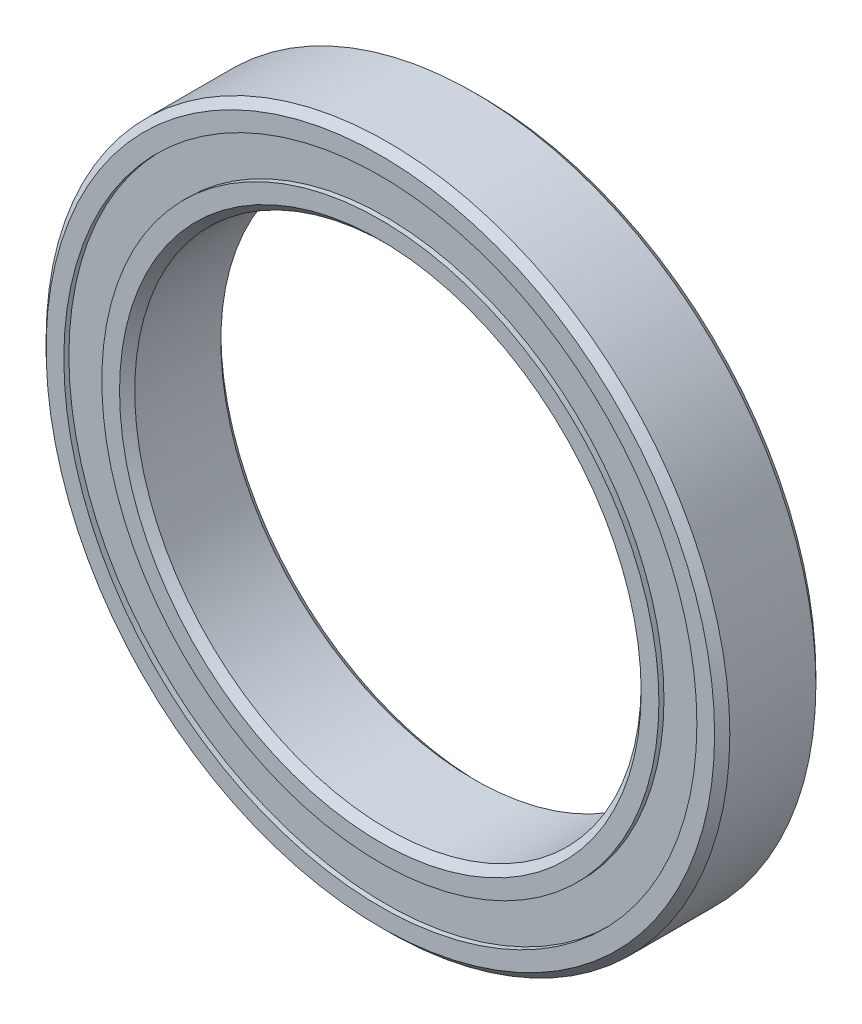
ISO-10303-21;
HEADER;
FILE_DESCRIPTION(('STEP AP214'),'2;1');
FILE_NAME('part.step','',(''),(''),'','','');
FILE_SCHEMA(('AUTOMOTIVE_DESIGN { 1 0 10303 214 1 1 1 1 }'));
ENDSEC;
DATA;
#1=APPLICATION_CONTEXT('core data for automotive mechanical design processes');
#2=APPLICATION_PROTOCOL_DEFINITION('international standard','automotive_design',2000,#1);
#3=PRODUCT_CONTEXT('',#1,'mechanical');
#4=PRODUCT('Part','Part','',(#3));
#5=PRODUCT_RELATED_PRODUCT_CATEGORY('part','',(#4));
#6=PRODUCT_DEFINITION_FORMATION('','',#4);
#7=PRODUCT_DEFINITION_CONTEXT('part definition',#1,'design');
#8=PRODUCT_DEFINITION('design','',#6,#7);
#9=PRODUCT_DEFINITION_SHAPE('','',#8);
#10=(LENGTH_UNIT() NAMED_UNIT(*) SI_UNIT(.MILLI.,.METRE.));
#11=(NAMED_UNIT(*) PLANE_ANGLE_UNIT() SI_UNIT($,.RADIAN.));
#12=(NAMED_UNIT(*) SI_UNIT($,.STERADIAN.) SOLID_ANGLE_UNIT());
#13=UNCERTAINTY_MEASURE_WITH_UNIT(LENGTH_MEASURE(1.E-05),#10,'distance_accuracy_value','');
#14=(GEOMETRIC_REPRESENTATION_CONTEXT(3) GLOBAL_UNCERTAINTY_ASSIGNED_CONTEXT((#13)) GLOBAL_UNIT_ASSIGNED_CONTEXT((#10,
#11,#12)) REPRESENTATION_CONTEXT('',''));
#15=CARTESIAN_POINT('',(0.,0.,0.));
#16=DIRECTION('',(0.,0.,1.));
#17=DIRECTION('',(1.,0.,0.));
#18=AXIS2_PLACEMENT_3D('',#15,#16,#17);
#19=CARTESIAN_POINT('',(0.,0.,1.7));
#20=DIRECTION('',(0.,0.,1.));
#21=DIRECTION('',(1.,0.,0.));
#22=AXIS2_PLACEMENT_3D('',#19,#20,#21);
#23=CONICAL_SURFACE('',#22,10.,0.7853981625);
#24=CARTESIAN_POINT('',(0.,0.,1.7));
#25=DIRECTION('',(0.,0.,1.));
#26=DIRECTION('',(1.,0.,0.));
#27=AXIS2_PLACEMENT_3D('',#24,#25,#26);
#28=CIRCLE('',#27,10.);
#29=CARTESIAN_POINT('',(10.,0.,1.7));
#30=VERTEX_POINT('',#29);
#31=EDGE_CURVE('E110',#30,#30,#28,.T.);
#32=ORIENTED_EDGE('',*,*,#31,.F.);
#33=EDGE_LOOP('',(#32));
#34=FACE_BOUND('',#33,.T.);
#35=CARTESIAN_POINT('',(0.,0.,2.));
#36=DIRECTION('',(0.,0.,-1.));
#37=DIRECTION('',(1.,0.,0.));
#38=AXIS2_PLACEMENT_3D('',#35,#36,#37);
#39=CIRCLE('',#38,10.3);
#40=CARTESIAN_POINT('',(10.3,0.,2.));
#41=VERTEX_POINT('',#40);
#42=EDGE_CURVE('E125',#41,#41,#39,.T.);
#43=ORIENTED_EDGE('',*,*,#42,.F.);
#44=EDGE_LOOP('',(#43));
#45=FACE_BOUND('',#44,.T.);
#46=ADVANCED_FACE('F17',(#34,#45),#23,.F.);
#47=CARTESIAN_POINT('',(0.,0.,-2.));
#48=DIRECTION('',(0.,0.,-1.));
#49=DIRECTION('',(-1.,0.,0.));
#50=AXIS2_PLACEMENT_3D('',#47,#48,#49);
#51=CONICAL_SURFACE('',#50,10.3,0.7853981625);
#52=CARTESIAN_POINT('',(0.,0.,-2.));
#53=DIRECTION('',(0.,0.,1.));
#54=DIRECTION('',(1.,0.,0.));
#55=AXIS2_PLACEMENT_3D('',#52,#53,#54);
#56=CIRCLE('',#55,10.3);
#57=CARTESIAN_POINT('',(10.3,0.,-2.));
#58=VERTEX_POINT('',#57);
#59=EDGE_CURVE('E138',#58,#58,#56,.T.);
#60=ORIENTED_EDGE('',*,*,#59,.F.);
#61=EDGE_LOOP('',(#60));
#62=FACE_BOUND('',#61,.T.);
#63=CARTESIAN_POINT('',(0.,0.,-1.7));
#64=DIRECTION('',(0.,0.,-1.));
#65=DIRECTION('',(1.,0.,0.));
#66=AXIS2_PLACEMENT_3D('',#63,#64,#65);
#67=CIRCLE('',#66,10.);
#68=CARTESIAN_POINT('',(10.,0.,-1.7));
#69=VERTEX_POINT('',#68);
#70=EDGE_CURVE('E114',#69,#69,#67,.T.);
#71=ORIENTED_EDGE('',*,*,#70,.F.);
#72=EDGE_LOOP('',(#71));
#73=FACE_BOUND('',#72,.T.);
#74=ADVANCED_FACE('F151',(#62,#73),#51,.F.);
#75=CARTESIAN_POINT('',(0.,0.,-1.7));
#76=DIRECTION('',(0.,0.,1.));
#77=DIRECTION('',(1.,0.,0.));
#78=AXIS2_PLACEMENT_3D('',#75,#76,#77);
#79=CONICAL_SURFACE('',#78,13.5,0.7853981625);
#80=CARTESIAN_POINT('',(0.,0.,-1.7));
#81=DIRECTION('',(0.,0.,1.));
#82=DIRECTION('',(1.,0.,0.));
#83=AXIS2_PLACEMENT_3D('',#80,#81,#82);
#84=CIRCLE('',#83,13.5);
#85=CARTESIAN_POINT('',(13.5,0.,-1.7));
#86=VERTEX_POINT('',#85);
#87=EDGE_CURVE('E115',#86,#86,#84,.T.);
#88=ORIENTED_EDGE('',*,*,#87,.F.);
#89=EDGE_LOOP('',(#88));
#90=FACE_BOUND('',#89,.T.);
#91=CARTESIAN_POINT('',(0.,0.,-2.));
#92=DIRECTION('',(0.,0.,-1.));
#93=DIRECTION('',(1.,0.,0.));
#94=AXIS2_PLACEMENT_3D('',#91,#92,#93);
#95=CIRCLE('',#94,13.2);
#96=CARTESIAN_POINT('',(13.2,0.,-2.));
#97=VERTEX_POINT('',#96);
#98=EDGE_CURVE('E107',#97,#97,#95,.T.);
#99=ORIENTED_EDGE('',*,*,#98,.F.);
#100=EDGE_LOOP('',(#99));
#101=FACE_BOUND('',#100,.T.);
#102=ADVANCED_FACE('F148',(#90,#101),#79,.T.);
#103=CARTESIAN_POINT('',(0.,0.,2.));
#104=DIRECTION('',(0.,0.,-1.));
#105=DIRECTION('',(-1.,0.,0.));
#106=AXIS2_PLACEMENT_3D('',#103,#104,#105);
#107=CONICAL_SURFACE('',#106,13.2,0.7853981625);
#108=CARTESIAN_POINT('',(0.,0.,2.));
#109=DIRECTION('',(0.,0.,1.));
#110=DIRECTION('',(1.,0.,0.));
#111=AXIS2_PLACEMENT_3D('',#108,#109,#110);
#112=CIRCLE('',#111,13.2);
#113=CARTESIAN_POINT('',(13.2,0.,2.));
#114=VERTEX_POINT('',#113);
#115=EDGE_CURVE('E113',#114,#114,#112,.T.);
#116=ORIENTED_EDGE('',*,*,#115,.F.);
#117=EDGE_LOOP('',(#116));
#118=FACE_BOUND('',#117,.T.);
#119=CARTESIAN_POINT('',(0.,0.,1.7));
#120=DIRECTION('',(0.,0.,-1.));
#121=DIRECTION('',(1.,0.,0.));
#122=AXIS2_PLACEMENT_3D('',#119,#120,#121);
#123=CIRCLE('',#122,13.5);
#124=CARTESIAN_POINT('',(13.5,0.,1.7));
#125=VERTEX_POINT('',#124);
#126=EDGE_CURVE('E118',#125,#125,#123,.T.);
#127=ORIENTED_EDGE('',*,*,#126,.F.);
#128=EDGE_LOOP('',(#127));
#129=FACE_BOUND('',#128,.T.);
#130=ADVANCED_FACE('F150',(#118,#129),#107,.T.);
#131=CARTESIAN_POINT('',(0.,0.,-1.8));
#132=DIRECTION('',(0.,0.,1.));
#133=DIRECTION('',(1.,0.,0.));
#134=AXIS2_PLACEMENT_3D('',#131,#132,#133);
#135=PLANE('',#134);
#136=CARTESIAN_POINT('',(0.,0.,-1.8));
#137=DIRECTION('',(0.,0.,-1.));
#138=DIRECTION('',(1.,0.,0.));
#139=AXIS2_PLACEMENT_3D('',#136,#137,#138);
#140=CIRCLE('',#139,11.);
#141=CARTESIAN_POINT('',(11.,0.,-1.8));
#142=VERTEX_POINT('',#141);
#143=EDGE_CURVE('E11',#142,#142,#140,.T.);
#144=ORIENTED_EDGE('',*,*,#143,.F.);
#145=EDGE_LOOP('',(#144));
#146=FACE_BOUND('',#145,.T.);
#147=CARTESIAN_POINT('',(0.,0.,-1.8));
#148=DIRECTION('',(0.,0.,-1.));
#149=DIRECTION('',(1.,0.,0.));
#150=AXIS2_PLACEMENT_3D('',#147,#148,#149);
#151=CIRCLE('',#150,12.5);
#152=CARTESIAN_POINT('',(12.5,0.,-1.8));
#153=VERTEX_POINT('',#152);
#154=EDGE_CURVE('E21',#153,#153,#151,.T.);
#155=ORIENTED_EDGE('',*,*,#154,.T.);
#156=EDGE_LOOP('',(#155));
#157=FACE_BOUND('',#156,.T.);
#158=ADVANCED_FACE('F19',(#146,#157),#135,.F.);
#159=CARTESIAN_POINT('',(0.,0.,-1.8));
#160=DIRECTION('',(0.,0.,-1.));
#161=DIRECTION('',(-1.,0.,0.));
#162=AXIS2_PLACEMENT_3D('',#159,#160,#161);
#163=CYLINDRICAL_SURFACE('',#162,11.);
#164=CARTESIAN_POINT('',(0.,0.,-2.));
#165=DIRECTION('',(0.,0.,1.));
#166=DIRECTION('',(1.,0.,0.));
#167=AXIS2_PLACEMENT_3D('',#164,#165,#166);
#168=CIRCLE('',#167,11.);
#169=CARTESIAN_POINT('',(11.,0.,-2.));
#170=VERTEX_POINT('',#169);
#171=EDGE_CURVE('E130',#170,#170,#168,.T.);
#172=ORIENTED_EDGE('',*,*,#171,.T.);
#173=EDGE_LOOP('',(#172));
#174=FACE_BOUND('',#173,.T.);
#175=ORIENTED_EDGE('',*,*,#143,.T.);
#176=EDGE_LOOP('',(#175));
#177=FACE_BOUND('',#176,.T.);
#178=ADVANCED_FACE('F188',(#174,#177),#163,.T.);
#179=CARTESIAN_POINT('',(0.,0.,-1.8));
#180=DIRECTION('',(0.,0.,-1.));
#181=DIRECTION('',(-1.,0.,0.));
#182=AXIS2_PLACEMENT_3D('',#179,#180,#181);
#183=CYLINDRICAL_SURFACE('',#182,12.5);
#184=CARTESIAN_POINT('',(0.,0.,-2.));
#185=DIRECTION('',(0.,0.,1.));
#186=DIRECTION('',(1.,0.,0.));
#187=AXIS2_PLACEMENT_3D('',#184,#185,#186);
#188=CIRCLE('',#187,12.5);
#189=CARTESIAN_POINT('',(12.5,0.,-2.));
#190=VERTEX_POINT('',#189);
#191=EDGE_CURVE('E101',#190,#190,#188,.T.);
#192=ORIENTED_EDGE('',*,*,#191,.F.);
#193=EDGE_LOOP('',(#192));
#194=FACE_BOUND('',#193,.T.);
#195=ORIENTED_EDGE('',*,*,#154,.F.);
#196=EDGE_LOOP('',(#195));
#197=FACE_BOUND('',#196,.T.);
#198=ADVANCED_FACE('F191',(#194,#197),#183,.F.);
#199=CARTESIAN_POINT('',(0.,0.,1.8));
#200=DIRECTION('',(0.,0.,1.));
#201=DIRECTION('',(1.,0.,0.));
#202=AXIS2_PLACEMENT_3D('',#199,#200,#201);
#203=PLANE('',#202);
#204=CARTESIAN_POINT('',(0.,0.,1.8));
#205=DIRECTION('',(0.,0.,-1.));
#206=DIRECTION('',(1.,0.,0.));
#207=AXIS2_PLACEMENT_3D('',#204,#205,#206);
#208=CIRCLE('',#207,11.);
#209=CARTESIAN_POINT('',(11.,0.,1.8));
#210=VERTEX_POINT('',#209);
#211=EDGE_CURVE('E100',#210,#210,#208,.T.);
#212=ORIENTED_EDGE('',*,*,#211,.T.);
#213=EDGE_LOOP('',(#212));
#214=FACE_BOUND('',#213,.T.);
#215=CARTESIAN_POINT('',(0.,0.,1.8));
#216=DIRECTION('',(0.,0.,-1.));
#217=DIRECTION('',(1.,0.,0.));
#218=AXIS2_PLACEMENT_3D('',#215,#216,#217);
#219=CIRCLE('',#218,12.5);
#220=CARTESIAN_POINT('',(12.5,0.,1.8));
#221=VERTEX_POINT('',#220);
#222=EDGE_CURVE('E96',#221,#221,#219,.T.);
#223=ORIENTED_EDGE('',*,*,#222,.F.);
#224=EDGE_LOOP('',(#223));
#225=FACE_BOUND('',#224,.T.);
#226=ADVANCED_FACE('F204',(#214,#225),#203,.T.);
#227=CARTESIAN_POINT('',(0.,0.,1.8));
#228=DIRECTION('',(0.,0.,1.));
#229=DIRECTION('',(1.,0.,0.));
#230=AXIS2_PLACEMENT_3D('',#227,#228,#229);
#231=CYLINDRICAL_SURFACE('',#230,11.);
#232=CARTESIAN_POINT('',(0.,0.,2.));
#233=DIRECTION('',(0.,0.,1.));
#234=DIRECTION('',(1.,0.,0.));
#235=AXIS2_PLACEMENT_3D('',#232,#233,#234);
#236=CIRCLE('',#235,11.);
#237=CARTESIAN_POINT('',(11.,0.,2.));
#238=VERTEX_POINT('',#237);
#239=EDGE_CURVE('E122',#238,#238,#236,.T.);
#240=ORIENTED_EDGE('',*,*,#239,.F.);
#241=EDGE_LOOP('',(#240));
#242=FACE_BOUND('',#241,.T.);
#243=ORIENTED_EDGE('',*,*,#211,.F.);
#244=EDGE_LOOP('',(#243));
#245=FACE_BOUND('',#244,.T.);
#246=ADVANCED_FACE('F201',(#242,#245),#231,.T.);
#247=CARTESIAN_POINT('',(0.,0.,1.8));
#248=DIRECTION('',(0.,0.,1.));
#249=DIRECTION('',(1.,0.,0.));
#250=AXIS2_PLACEMENT_3D('',#247,#248,#249);
#251=CYLINDRICAL_SURFACE('',#250,12.5);
#252=CARTESIAN_POINT('',(0.,0.,2.));
#253=DIRECTION('',(0.,0.,1.));
#254=DIRECTION('',(1.,0.,0.));
#255=AXIS2_PLACEMENT_3D('',#252,#253,#254);
#256=CIRCLE('',#255,12.5);
#257=CARTESIAN_POINT('',(12.5,0.,2.));
#258=VERTEX_POINT('',#257);
#259=EDGE_CURVE('E133',#258,#258,#256,.T.);
#260=ORIENTED_EDGE('',*,*,#259,.T.);
#261=EDGE_LOOP('',(#260));
#262=FACE_BOUND('',#261,.T.);
#263=ORIENTED_EDGE('',*,*,#222,.T.);
#264=EDGE_LOOP('',(#263));
#265=FACE_BOUND('',#264,.T.);
#266=ADVANCED_FACE('F97',(#262,#265),#251,.F.);
#267=CARTESIAN_POINT('',(0.,0.,-2.));
#268=DIRECTION('',(0.,0.,1.));
#269=DIRECTION('',(1.,0.,0.));
#270=AXIS2_PLACEMENT_3D('',#267,#268,#269);
#271=PLANE('',#270);
#272=ORIENTED_EDGE('',*,*,#191,.T.);
#273=EDGE_LOOP('',(#272));
#274=FACE_BOUND('',#273,.T.);
#275=ORIENTED_EDGE('',*,*,#98,.T.);
#276=EDGE_LOOP('',(#275));
#277=FACE_BOUND('',#276,.T.);
#278=ADVANCED_FACE('F146',(#274,#277),#271,.F.);
#279=CARTESIAN_POINT('',(0.,0.,2.));
#280=DIRECTION('',(0.,0.,1.));
#281=DIRECTION('',(1.,0.,0.));
#282=AXIS2_PLACEMENT_3D('',#279,#280,#281);
#283=PLANE('',#282);
#284=ORIENTED_EDGE('',*,*,#259,.F.);
#285=EDGE_LOOP('',(#284));
#286=FACE_BOUND('',#285,.T.);
#287=ORIENTED_EDGE('',*,*,#115,.T.);
#288=EDGE_LOOP('',(#287));
#289=FACE_BOUND('',#288,.T.);
#290=ADVANCED_FACE('F186',(#286,#289),#283,.T.);
#291=CARTESIAN_POINT('',(0.,0.,2.));
#292=DIRECTION('',(0.,0.,-1.));
#293=DIRECTION('',(-1.,0.,0.));
#294=AXIS2_PLACEMENT_3D('',#291,#292,#293);
#295=CYLINDRICAL_SURFACE('',#294,10.);
#296=ORIENTED_EDGE('',*,*,#31,.T.);
#297=EDGE_LOOP('',(#296));
#298=FACE_BOUND('',#297,.T.);
#299=ORIENTED_EDGE('',*,*,#70,.T.);
#300=EDGE_LOOP('',(#299));
#301=FACE_BOUND('',#300,.T.);
#302=ADVANCED_FACE('F182',(#298,#301),#295,.F.);
#303=CARTESIAN_POINT('',(0.,0.,2.));
#304=DIRECTION('',(0.,0.,-1.));
#305=DIRECTION('',(-1.,0.,0.));
#306=AXIS2_PLACEMENT_3D('',#303,#304,#305);
#307=CYLINDRICAL_SURFACE('',#306,13.5);
#308=ORIENTED_EDGE('',*,*,#87,.T.);
#309=EDGE_LOOP('',(#308));
#310=FACE_BOUND('',#309,.T.);
#311=ORIENTED_EDGE('',*,*,#126,.T.);
#312=EDGE_LOOP('',(#311));
#313=FACE_BOUND('',#312,.T.);
#314=ADVANCED_FACE('F178',(#310,#313),#307,.T.);
#315=CARTESIAN_POINT('',(0.,0.,2.));
#316=DIRECTION('',(0.,0.,1.));
#317=DIRECTION('',(1.,0.,0.));
#318=AXIS2_PLACEMENT_3D('',#315,#316,#317);
#319=PLANE('',#318);
#320=ORIENTED_EDGE('',*,*,#239,.T.);
#321=EDGE_LOOP('',(#320));
#322=FACE_BOUND('',#321,.T.);
#323=ORIENTED_EDGE('',*,*,#42,.T.);
#324=EDGE_LOOP('',(#323));
#325=FACE_BOUND('',#324,.T.);
#326=ADVANCED_FACE('F175',(#322,#325),#319,.T.);
#327=CARTESIAN_POINT('',(0.,0.,-2.));
#328=DIRECTION('',(0.,0.,1.));
#329=DIRECTION('',(1.,0.,0.));
#330=AXIS2_PLACEMENT_3D('',#327,#328,#329);
#331=PLANE('',#330);
#332=ORIENTED_EDGE('',*,*,#171,.F.);
#333=EDGE_LOOP('',(#332));
#334=FACE_BOUND('',#333,.T.);
#335=ORIENTED_EDGE('',*,*,#59,.T.);
#336=EDGE_LOOP('',(#335));
#337=FACE_BOUND('',#336,.T.);
#338=ADVANCED_FACE('F174',(#334,#337),#331,.F.);
#339=CLOSED_SHELL('',(#46,#74,#102,#130,#158,#178,#198,#226,#246,#266,#278,#290,#302,#314,#326,#338));
#340=MANIFOLD_SOLID_BREP('B1',#339);
#341=ADVANCED_BREP_SHAPE_REPRESENTATION('',(#18,#340),#14);
#342=SHAPE_DEFINITION_REPRESENTATION(#9,#341);
ENDSEC;
END-ISO-10303-21;
